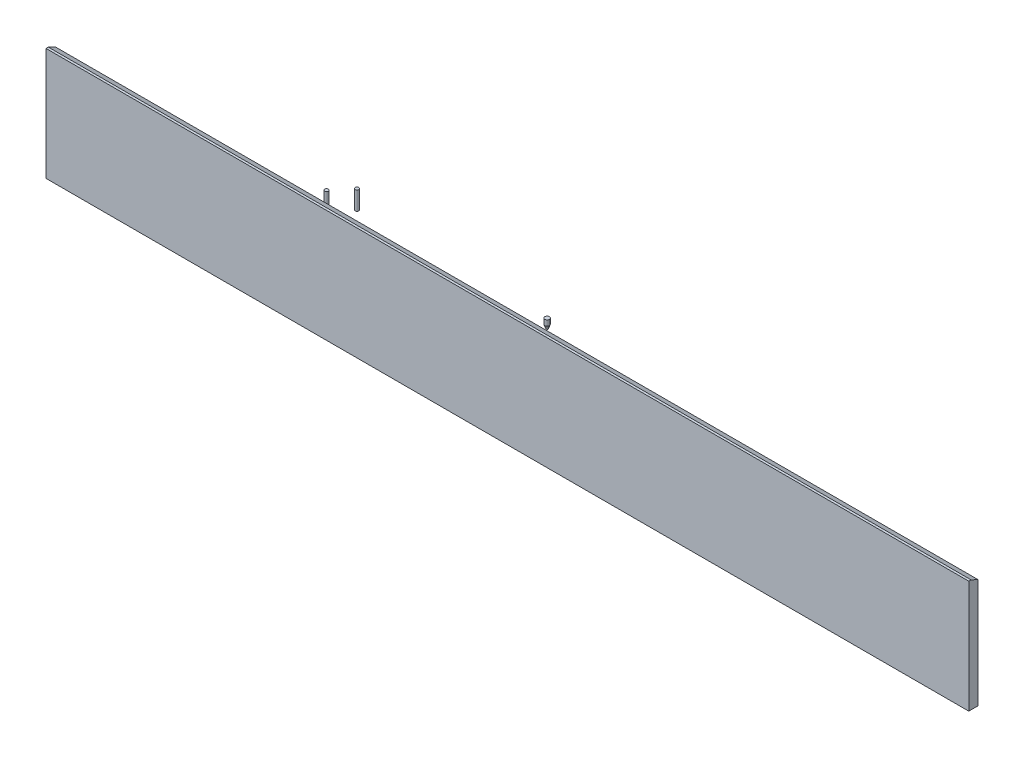
ISO-10303-21;
HEADER;
FILE_DESCRIPTION(('STEP AP214'),'2;1');
FILE_NAME('part.step','',(''),(''),'','','');
FILE_SCHEMA(('AUTOMOTIVE_DESIGN { 1 0 10303 214 1 1 1 1 }'));
ENDSEC;
DATA;
#1=APPLICATION_CONTEXT('core data for automotive mechanical design processes');
#2=APPLICATION_PROTOCOL_DEFINITION('international standard','automotive_design',2000,#1);
#3=PRODUCT_CONTEXT('',#1,'mechanical');
#4=PRODUCT('Part','Part','',(#3));
#5=PRODUCT_RELATED_PRODUCT_CATEGORY('part','',(#4));
#6=PRODUCT_DEFINITION_FORMATION('','',#4);
#7=PRODUCT_DEFINITION_CONTEXT('part definition',#1,'design');
#8=PRODUCT_DEFINITION('design','',#6,#7);
#9=PRODUCT_DEFINITION_SHAPE('','',#8);
#10=(LENGTH_UNIT() NAMED_UNIT(*) SI_UNIT(.MILLI.,.METRE.));
#11=(NAMED_UNIT(*) PLANE_ANGLE_UNIT() SI_UNIT($,.RADIAN.));
#12=(NAMED_UNIT(*) SI_UNIT($,.STERADIAN.) SOLID_ANGLE_UNIT());
#13=UNCERTAINTY_MEASURE_WITH_UNIT(LENGTH_MEASURE(1.E-05),#10,'distance_accuracy_value','');
#14=(GEOMETRIC_REPRESENTATION_CONTEXT(3) GLOBAL_UNCERTAINTY_ASSIGNED_CONTEXT((#13)) GLOBAL_UNIT_ASSIGNED_CONTEXT((#10,
#11,#12)) REPRESENTATION_CONTEXT('',''));
#15=CARTESIAN_POINT('',(0.,0.,0.));
#16=DIRECTION('',(0.,0.,1.));
#17=DIRECTION('',(1.,0.,0.));
#18=AXIS2_PLACEMENT_3D('',#15,#16,#17);
#19=CARTESIAN_POINT('',(-251.,10.,-78.));
#20=DIRECTION('',(0.,-1.,0.));
#21=DIRECTION('',(0.,0.,-1.));
#22=AXIS2_PLACEMENT_3D('',#19,#20,#21);
#23=CYLINDRICAL_SURFACE('',#22,2.);
#24=CARTESIAN_POINT('',(-251.,10.,-78.));
#25=DIRECTION('',(0.,1.,0.));
#26=DIRECTION('',(0.,0.,1.));
#27=AXIS2_PLACEMENT_3D('',#24,#25,#26);
#28=CIRCLE('',#27,2.);
#29=CARTESIAN_POINT('',(-251.,10.,-76.));
#30=VERTEX_POINT('',#29);
#31=EDGE_CURVE('E11',#30,#30,#28,.T.);
#32=ORIENTED_EDGE('',*,*,#31,.F.);
#33=EDGE_LOOP('',(#32));
#34=FACE_BOUND('',#33,.T.);
#35=CARTESIAN_POINT('',(-251.,-10.,-78.));
#36=DIRECTION('',(0.,1.,0.));
#37=DIRECTION('',(0.,0.,1.));
#38=AXIS2_PLACEMENT_3D('',#35,#36,#37);
#39=CIRCLE('',#38,2.);
#40=CARTESIAN_POINT('',(-251.,-10.,-76.));
#41=VERTEX_POINT('',#40);
#42=EDGE_CURVE('E51',#41,#41,#39,.T.);
#43=ORIENTED_EDGE('',*,*,#42,.T.);
#44=EDGE_LOOP('',(#43));
#45=FACE_BOUND('',#44,.T.);
#46=ADVANCED_FACE('F48',(#34,#45),#23,.T.);
#47=CARTESIAN_POINT('',(-251.,10.,-78.));
#48=DIRECTION('',(0.,1.,0.));
#49=DIRECTION('',(0.,0.,1.));
#50=AXIS2_PLACEMENT_3D('',#47,#48,#49);
#51=PLANE('',#50);
#52=ORIENTED_EDGE('',*,*,#31,.T.);
#53=EDGE_LOOP('',(#52));
#54=FACE_BOUND('',#53,.T.);
#55=ADVANCED_FACE('F63',(#54),#51,.T.);
#56=CARTESIAN_POINT('',(-251.,-10.,-78.));
#57=DIRECTION('',(0.,1.,0.));
#58=DIRECTION('',(0.,0.,1.));
#59=AXIS2_PLACEMENT_3D('',#56,#57,#58);
#60=PLANE('',#59);
#61=ORIENTED_EDGE('',*,*,#42,.F.);
#62=EDGE_LOOP('',(#61));
#63=FACE_BOUND('',#62,.T.);
#64=ADVANCED_FACE('F61',(#63),#60,.F.);
#65=CLOSED_SHELL('',(#46,#55,#64));
#66=MANIFOLD_SOLID_BREP('B2',#65);
#67=CARTESIAN_POINT('',(-266.,10.,-60.));
#68=DIRECTION('',(0.,-1.,0.));
#69=DIRECTION('',(0.,0.,-1.));
#70=AXIS2_PLACEMENT_3D('',#67,#68,#69);
#71=CYLINDRICAL_SURFACE('',#70,2.);
#72=CARTESIAN_POINT('',(-266.,10.,-60.));
#73=DIRECTION('',(0.,1.,0.));
#74=DIRECTION('',(0.,0.,1.));
#75=AXIS2_PLACEMENT_3D('',#72,#73,#74);
#76=CIRCLE('',#75,2.);
#77=CARTESIAN_POINT('',(-266.,10.,-58.));
#78=VERTEX_POINT('',#77);
#79=EDGE_CURVE('E47',#78,#78,#76,.T.);
#80=ORIENTED_EDGE('',*,*,#79,.F.);
#81=EDGE_LOOP('',(#80));
#82=FACE_BOUND('',#81,.T.);
#83=CARTESIAN_POINT('',(-266.,-10.,-60.));
#84=DIRECTION('',(0.,1.,0.));
#85=DIRECTION('',(0.,0.,1.));
#86=AXIS2_PLACEMENT_3D('',#83,#84,#85);
#87=CIRCLE('',#86,2.);
#88=CARTESIAN_POINT('',(-266.,-10.,-58.));
#89=VERTEX_POINT('',#88);
#90=EDGE_CURVE('E100',#89,#89,#87,.T.);
#91=ORIENTED_EDGE('',*,*,#90,.T.);
#92=EDGE_LOOP('',(#91));
#93=FACE_BOUND('',#92,.T.);
#94=ADVANCED_FACE('F97',(#82,#93),#71,.T.);
#95=CARTESIAN_POINT('',(-266.,10.,-60.));
#96=DIRECTION('',(0.,1.,0.));
#97=DIRECTION('',(0.,0.,1.));
#98=AXIS2_PLACEMENT_3D('',#95,#96,#97);
#99=PLANE('',#98);
#100=ORIENTED_EDGE('',*,*,#79,.T.);
#101=EDGE_LOOP('',(#100));
#102=FACE_BOUND('',#101,.T.);
#103=ADVANCED_FACE('F112',(#102),#99,.T.);
#104=CARTESIAN_POINT('',(-266.,-10.,-60.));
#105=DIRECTION('',(0.,1.,0.));
#106=DIRECTION('',(0.,0.,1.));
#107=AXIS2_PLACEMENT_3D('',#104,#105,#106);
#108=PLANE('',#107);
#109=ORIENTED_EDGE('',*,*,#90,.F.);
#110=EDGE_LOOP('',(#109));
#111=FACE_BOUND('',#110,.T.);
#112=ADVANCED_FACE('F110',(#111),#108,.F.);
#113=CLOSED_SHELL('',(#94,#103,#112));
#114=MANIFOLD_SOLID_BREP('B6',#113);
#115=CARTESIAN_POINT('',(-22.,36.5,-10.));
#116=DIRECTION('',(0.,-1.,0.));
#117=DIRECTION('',(0.,0.,-1.));
#118=AXIS2_PLACEMENT_3D('',#115,#116,#117);
#119=CYLINDRICAL_SURFACE('',#118,2.5);
#120=CARTESIAN_POINT('',(-22.,36.5,-10.));
#121=DIRECTION('',(0.,1.,0.));
#122=DIRECTION('',(0.,0.,1.));
#123=AXIS2_PLACEMENT_3D('',#120,#121,#122);
#124=CIRCLE('',#123,2.5);
#125=CARTESIAN_POINT('',(-22.,36.5,-7.5));
#126=VERTEX_POINT('',#125);
#127=EDGE_CURVE('E96',#126,#126,#124,.T.);
#128=ORIENTED_EDGE('',*,*,#127,.F.);
#129=EDGE_LOOP('',(#128));
#130=FACE_BOUND('',#129,.T.);
#131=CARTESIAN_POINT('',(-22.,26.5,-10.));
#132=DIRECTION('',(0.,1.,0.));
#133=DIRECTION('',(0.,0.,1.));
#134=AXIS2_PLACEMENT_3D('',#131,#132,#133);
#135=CIRCLE('',#134,2.5);
#136=CARTESIAN_POINT('',(-22.,26.5,-7.5));
#137=VERTEX_POINT('',#136);
#138=EDGE_CURVE('E149',#137,#137,#135,.T.);
#139=ORIENTED_EDGE('',*,*,#138,.T.);
#140=EDGE_LOOP('',(#139));
#141=FACE_BOUND('',#140,.T.);
#142=ADVANCED_FACE('F146',(#130,#141),#119,.T.);
#143=CARTESIAN_POINT('',(-22.,36.5,-10.));
#144=DIRECTION('',(0.,1.,0.));
#145=DIRECTION('',(0.,0.,1.));
#146=AXIS2_PLACEMENT_3D('',#143,#144,#145);
#147=PLANE('',#146);
#148=ORIENTED_EDGE('',*,*,#127,.T.);
#149=EDGE_LOOP('',(#148));
#150=FACE_BOUND('',#149,.T.);
#151=ADVANCED_FACE('F161',(#150),#147,.T.);
#152=CARTESIAN_POINT('',(-22.,26.5,-10.));
#153=DIRECTION('',(0.,1.,0.));
#154=DIRECTION('',(0.,0.,1.));
#155=AXIS2_PLACEMENT_3D('',#152,#153,#154);
#156=PLANE('',#155);
#157=ORIENTED_EDGE('',*,*,#138,.F.);
#158=EDGE_LOOP('',(#157));
#159=FACE_BOUND('',#158,.T.);
#160=ADVANCED_FACE('F159',(#159),#156,.F.);
#161=CLOSED_SHELL('',(#142,#151,#160));
#162=MANIFOLD_SOLID_BREP('B42',#161);
#163=CARTESIAN_POINT('',(0.,36.5,-33.));
#164=DIRECTION('',(0.,-1.,0.));
#165=DIRECTION('',(0.,0.,-1.));
#166=AXIS2_PLACEMENT_3D('',#163,#164,#165);
#167=CYLINDRICAL_SURFACE('',#166,2.5);
#168=CARTESIAN_POINT('',(0.,30.6212161291819,-33.));
#169=DIRECTION('',(0.,1.,0.));
#170=DIRECTION('',(0.,0.,1.));
#171=AXIS2_PLACEMENT_3D('',#168,#169,#170);
#172=CIRCLE('',#171,2.5);
#173=CARTESIAN_POINT('',(0.,30.6212161291819,-30.5));
#174=VERTEX_POINT('',#173);
#175=EDGE_CURVE('E203',#174,#174,#172,.T.);
#176=ORIENTED_EDGE('',*,*,#175,.T.);
#177=EDGE_LOOP('',(#176));
#178=FACE_BOUND('',#177,.T.);
#179=CARTESIAN_POINT('',(0.,36.5,-33.));
#180=DIRECTION('',(0.,1.,0.));
#181=DIRECTION('',(0.,0.,1.));
#182=AXIS2_PLACEMENT_3D('',#179,#180,#181);
#183=CIRCLE('',#182,2.5);
#184=CARTESIAN_POINT('',(0.,36.5,-30.5));
#185=VERTEX_POINT('',#184);
#186=EDGE_CURVE('E207',#185,#185,#183,.T.);
#187=ORIENTED_EDGE('',*,*,#186,.F.);
#188=EDGE_LOOP('',(#187));
#189=FACE_BOUND('',#188,.T.);
#190=ADVANCED_FACE('F196',(#178,#189),#167,.T.);
#191=CARTESIAN_POINT('',(0.,36.5,-33.));
#192=DIRECTION('',(0.,1.,0.));
#193=DIRECTION('',(0.,0.,1.));
#194=AXIS2_PLACEMENT_3D('',#191,#192,#193);
#195=PLANE('',#194);
#196=ORIENTED_EDGE('',*,*,#186,.T.);
#197=EDGE_LOOP('',(#196));
#198=FACE_BOUND('',#197,.T.);
#199=ADVANCED_FACE('F214',(#198),#195,.T.);
#200=CARTESIAN_POINT('',(0.,26.5,-33.));
#201=DIRECTION('',(0.,1.,0.));
#202=DIRECTION('',(0.,0.,1.));
#203=AXIS2_PLACEMENT_3D('',#200,#201,#202);
#204=PLANE('',#203);
#205=CARTESIAN_POINT('',(0.,26.5,-33.));
#206=DIRECTION('',(0.,1.,0.));
#207=DIRECTION('',(0.,0.,1.));
#208=AXIS2_PLACEMENT_3D('',#205,#206,#207);
#209=CIRCLE('',#208,0.999999999999994);
#210=CARTESIAN_POINT('',(0.,26.5,-32.));
#211=VERTEX_POINT('',#210);
#212=EDGE_CURVE('E145',#211,#211,#209,.F.);
#213=ORIENTED_EDGE('',*,*,#212,.T.);
#214=EDGE_LOOP('',(#213));
#215=FACE_BOUND('',#214,.T.);
#216=ADVANCED_FACE('F220',(#215),#204,.F.);
#217=CARTESIAN_POINT('',(0.,30.6212161291819,-33.));
#218=DIRECTION('',(0.,1.,0.));
#219=DIRECTION('',(0.,0.,1.));
#220=AXIS2_PLACEMENT_3D('',#217,#218,#219);
#221=CONICAL_SURFACE('',#220,2.5,0.349065850398867);
#222=ORIENTED_EDGE('',*,*,#212,.F.);
#223=EDGE_LOOP('',(#222));
#224=FACE_BOUND('',#223,.T.);
#225=ORIENTED_EDGE('',*,*,#175,.F.);
#226=EDGE_LOOP('',(#225));
#227=FACE_BOUND('',#226,.T.);
#228=ADVANCED_FACE('F198',(#224,#227),#221,.T.);
#229=CLOSED_SHELL('',(#190,#199,#216,#228));
#230=MANIFOLD_SOLID_BREP('B91',#229);
#231=CARTESIAN_POINT('',(-500.,60.9999999999999,10.));
#232=DIRECTION('',(1.,0.,0.));
#233=DIRECTION('',(0.,1.,0.));
#234=AXIS2_PLACEMENT_3D('',#231,#232,#233);
#235=PLANE('',#234);
#236=DIRECTION('',(0.,0.,-1.));
#237=VECTOR('',#236,1.);
#238=CARTESIAN_POINT('',(-500.,60.9999999999999,10.));
#239=LINE('',#238,#237);
#240=CARTESIAN_POINT('',(-500.,60.9999999999999,10.));
#241=VERTEX_POINT('',#240);
#242=CARTESIAN_POINT('',(-500.,60.9999999999999,7.50577422178345));
#243=VERTEX_POINT('',#242);
#244=EDGE_CURVE('E538',#241,#243,#239,.T.);
#245=ORIENTED_EDGE('',*,*,#244,.T.);
#246=DIRECTION('',(0.,-0.422618261740706,-0.906307787036647));
#247=VECTOR('',#246,1.);
#248=CARTESIAN_POINT('',(-500.,60.9999999999999,7.50577422178332));
#249=LINE('',#248,#247);
#250=CARTESIAN_POINT('',(-500.,57.4999999999999,0.));
#251=VERTEX_POINT('',#250);
#252=EDGE_CURVE('E560',#243,#251,#249,.T.);
#253=ORIENTED_EDGE('',*,*,#252,.T.);
#254=DIRECTION('',(0.,-1.,0.));
#255=VECTOR('',#254,1.);
#256=CARTESIAN_POINT('',(-500.,60.9999999999999,0.));
#257=LINE('',#256,#255);
#258=CARTESIAN_POINT('',(-500.,-61.0000000000001,0.));
#259=VERTEX_POINT('',#258);
#260=EDGE_CURVE('E415',#251,#259,#257,.T.);
#261=ORIENTED_EDGE('',*,*,#260,.T.);
#262=DIRECTION('',(0.,0.,-1.));
#263=VECTOR('',#262,1.);
#264=CARTESIAN_POINT('',(-500.,-61.0000000000001,10.));
#265=LINE('',#264,#263);
#266=CARTESIAN_POINT('',(-500.,-61.0000000000001,10.));
#267=VERTEX_POINT('',#266);
#268=EDGE_CURVE('E553',#267,#259,#265,.T.);
#269=ORIENTED_EDGE('',*,*,#268,.F.);
#270=DIRECTION('',(0.,-1.,0.));
#271=VECTOR('',#270,1.);
#272=CARTESIAN_POINT('',(-500.,60.9999999999999,10.));
#273=LINE('',#272,#271);
#274=EDGE_CURVE('E525',#241,#267,#273,.T.);
#275=ORIENTED_EDGE('',*,*,#274,.F.);
#276=EDGE_LOOP('',(#245,#253,#261,#269,#275));
#277=FACE_BOUND('',#276,.T.);
#278=ADVANCED_FACE('F252',(#277),#235,.F.);
#279=CARTESIAN_POINT('',(500.,-60.9999999999999,10.));
#280=DIRECTION('',(0.,1.,0.));
#281=DIRECTION('',(-1.,0.,0.));
#282=AXIS2_PLACEMENT_3D('',#279,#280,#281);
#283=PLANE('',#282);
#284=DIRECTION('',(1.,0.,0.));
#285=VECTOR('',#284,1.);
#286=CARTESIAN_POINT('',(500.,-60.9999999999999,0.));
#287=LINE('',#286,#285);
#288=CARTESIAN_POINT('',(500.,-60.9999999999999,0.));
#289=VERTEX_POINT('',#288);
#290=EDGE_CURVE('E541',#259,#289,#287,.T.);
#291=ORIENTED_EDGE('',*,*,#290,.T.);
#292=DIRECTION('',(0.,0.,-1.));
#293=VECTOR('',#292,1.);
#294=CARTESIAN_POINT('',(500.,-60.9999999999999,10.));
#295=LINE('',#294,#293);
#296=CARTESIAN_POINT('',(500.,-60.9999999999999,10.));
#297=VERTEX_POINT('',#296);
#298=EDGE_CURVE('E550',#297,#289,#295,.T.);
#299=ORIENTED_EDGE('',*,*,#298,.F.);
#300=DIRECTION('',(1.,0.,0.));
#301=VECTOR('',#300,1.);
#302=CARTESIAN_POINT('',(500.,-60.9999999999999,10.));
#303=LINE('',#302,#301);
#304=EDGE_CURVE('E529',#267,#297,#303,.T.);
#305=ORIENTED_EDGE('',*,*,#304,.F.);
#306=ORIENTED_EDGE('',*,*,#268,.T.);
#307=EDGE_LOOP('',(#291,#299,#305,#306));
#308=FACE_BOUND('',#307,.T.);
#309=ADVANCED_FACE('F581',(#308),#283,.F.);
#310=CARTESIAN_POINT('',(500.,61.0000000000001,10.));
#311=DIRECTION('',(-1.,0.,0.));
#312=DIRECTION('',(0.,0.,1.));
#313=AXIS2_PLACEMENT_3D('',#310,#311,#312);
#314=PLANE('',#313);
#315=DIRECTION('',(0.,1.,0.));
#316=VECTOR('',#315,1.);
#317=CARTESIAN_POINT('',(500.,61.0000000000001,0.));
#318=LINE('',#317,#316);
#319=CARTESIAN_POINT('',(500.,57.5,0.));
#320=VERTEX_POINT('',#319);
#321=EDGE_CURVE('E530',#289,#320,#318,.T.);
#322=ORIENTED_EDGE('',*,*,#321,.T.);
#323=DIRECTION('',(0.,0.422618261740706,0.906307787036647));
#324=VECTOR('',#323,1.);
#325=CARTESIAN_POINT('',(500.,61.0000000000001,7.50577422178345));
#326=LINE('',#325,#324);
#327=CARTESIAN_POINT('',(500.,61.0000000000001,7.50577422178345));
#328=VERTEX_POINT('',#327);
#329=EDGE_CURVE('E194',#320,#328,#326,.T.);
#330=ORIENTED_EDGE('',*,*,#329,.T.);
#331=DIRECTION('',(0.,0.,-1.));
#332=VECTOR('',#331,1.);
#333=CARTESIAN_POINT('',(500.,61.0000000000001,10.));
#334=LINE('',#333,#332);
#335=CARTESIAN_POINT('',(500.,61.0000000000001,10.));
#336=VERTEX_POINT('',#335);
#337=EDGE_CURVE('E547',#336,#328,#334,.T.);
#338=ORIENTED_EDGE('',*,*,#337,.F.);
#339=DIRECTION('',(0.,1.,0.));
#340=VECTOR('',#339,1.);
#341=CARTESIAN_POINT('',(500.,61.0000000000001,10.));
#342=LINE('',#341,#340);
#343=EDGE_CURVE('E533',#297,#336,#342,.T.);
#344=ORIENTED_EDGE('',*,*,#343,.F.);
#345=ORIENTED_EDGE('',*,*,#298,.T.);
#346=EDGE_LOOP('',(#322,#330,#338,#344,#345));
#347=FACE_BOUND('',#346,.T.);
#348=ADVANCED_FACE('F572',(#347),#314,.F.);
#349=CARTESIAN_POINT('',(500.,61.0000000000001,10.));
#350=DIRECTION('',(0.,-1.,0.));
#351=DIRECTION('',(1.,0.,0.));
#352=AXIS2_PLACEMENT_3D('',#349,#350,#351);
#353=PLANE('',#352);
#354=ORIENTED_EDGE('',*,*,#337,.T.);
#355=DIRECTION('',(-1.,0.,0.));
#356=VECTOR('',#355,1.);
#357=CARTESIAN_POINT('',(-500.,60.9999999999999,7.50577422178345));
#358=LINE('',#357,#356);
#359=EDGE_CURVE('E556',#328,#243,#358,.T.);
#360=ORIENTED_EDGE('',*,*,#359,.T.);
#361=ORIENTED_EDGE('',*,*,#244,.F.);
#362=DIRECTION('',(-1.,0.,0.));
#363=VECTOR('',#362,1.);
#364=CARTESIAN_POINT('',(500.,61.0000000000001,10.));
#365=LINE('',#364,#363);
#366=EDGE_CURVE('E535',#336,#241,#365,.T.);
#367=ORIENTED_EDGE('',*,*,#366,.F.);
#368=EDGE_LOOP('',(#354,#360,#361,#367));
#369=FACE_BOUND('',#368,.T.);
#370=ADVANCED_FACE('F576',(#369),#353,.F.);
#371=CARTESIAN_POINT('',(0.,0.,10.));
#372=DIRECTION('',(0.,0.,-1.));
#373=DIRECTION('',(-1.,0.,0.));
#374=AXIS2_PLACEMENT_3D('',#371,#372,#373);
#375=PLANE('',#374);
#376=ORIENTED_EDGE('',*,*,#274,.T.);
#377=ORIENTED_EDGE('',*,*,#304,.T.);
#378=ORIENTED_EDGE('',*,*,#343,.T.);
#379=ORIENTED_EDGE('',*,*,#366,.T.);
#380=EDGE_LOOP('',(#376,#377,#378,#379));
#381=FACE_BOUND('',#380,.T.);
#382=ADVANCED_FACE('F578',(#381),#375,.F.);
#383=CARTESIAN_POINT('',(0.,0.,0.));
#384=DIRECTION('',(0.,0.,-1.));
#385=DIRECTION('',(-1.,0.,0.));
#386=AXIS2_PLACEMENT_3D('',#383,#384,#385);
#387=PLANE('',#386);
#388=DIRECTION('',(1.,0.,0.));
#389=VECTOR('',#388,1.);
#390=CARTESIAN_POINT('',(-276.,10.,0.));
#391=LINE('',#390,#389);
#392=CARTESIAN_POINT('',(-276.,10.,0.));
#393=VERTEX_POINT('',#392);
#394=CARTESIAN_POINT('',(-156.,10.,0.));
#395=VERTEX_POINT('',#394);
#396=EDGE_CURVE('E396',#393,#395,#391,.T.);
#397=ORIENTED_EDGE('',*,*,#396,.F.);
#398=DIRECTION('',(0.,-1.,0.));
#399=VECTOR('',#398,1.);
#400=CARTESIAN_POINT('',(-276.,10.,0.));
#401=LINE('',#400,#399);
#402=CARTESIAN_POINT('',(-276.,-10.,0.));
#403=VERTEX_POINT('',#402);
#404=EDGE_CURVE('E408',#393,#403,#401,.T.);
#405=ORIENTED_EDGE('',*,*,#404,.T.);
#406=DIRECTION('',(1.,0.,0.));
#407=VECTOR('',#406,1.);
#408=CARTESIAN_POINT('',(-276.,-10.,0.));
#409=LINE('',#408,#407);
#410=CARTESIAN_POINT('',(-156.,-10.,0.));
#411=VERTEX_POINT('',#410);
#412=EDGE_CURVE('E455',#403,#411,#409,.T.);
#413=ORIENTED_EDGE('',*,*,#412,.T.);
#414=DIRECTION('',(0.,-1.,0.));
#415=VECTOR('',#414,1.);
#416=CARTESIAN_POINT('',(-156.,10.,0.));
#417=LINE('',#416,#415);
#418=EDGE_CURVE('E416',#395,#411,#417,.T.);
#419=ORIENTED_EDGE('',*,*,#418,.F.);
#420=EDGE_LOOP('',(#397,#405,#413,#419));
#421=FACE_BOUND('',#420,.T.);
#422=ORIENTED_EDGE('',*,*,#260,.F.);
#423=DIRECTION('',(1.,0.,0.));
#424=VECTOR('',#423,1.);
#425=CARTESIAN_POINT('',(500.,57.5,0.));
#426=LINE('',#425,#424);
#427=EDGE_CURVE('E260',#251,#320,#426,.T.);
#428=ORIENTED_EDGE('',*,*,#427,.T.);
#429=ORIENTED_EDGE('',*,*,#321,.F.);
#430=ORIENTED_EDGE('',*,*,#290,.F.);
#431=EDGE_LOOP('',(#422,#428,#429,#430));
#432=FACE_BOUND('',#431,.T.);
#433=ADVANCED_FACE('F419',(#421,#432),#387,.T.);
#434=CARTESIAN_POINT('',(500.,61.0000000000001,7.50577422178345));
#435=DIRECTION('',(0.,0.906307787036647,-0.422618261740706));
#436=DIRECTION('',(1.,0.,0.));
#437=AXIS2_PLACEMENT_3D('',#434,#435,#436);
#438=PLANE('',#437);
#439=ORIENTED_EDGE('',*,*,#329,.F.);
#440=ORIENTED_EDGE('',*,*,#427,.F.);
#441=ORIENTED_EDGE('',*,*,#252,.F.);
#442=ORIENTED_EDGE('',*,*,#359,.F.);
#443=EDGE_LOOP('',(#439,#440,#441,#442));
#444=FACE_BOUND('',#443,.T.);
#445=ADVANCED_FACE('F254',(#444),#438,.T.);
#446=CARTESIAN_POINT('',(-276.,10.,-14.));
#447=DIRECTION('',(1.,0.,0.));
#448=DIRECTION('',(0.,0.,-1.));
#449=AXIS2_PLACEMENT_3D('',#446,#447,#448);
#450=PLANE('',#449);
#451=DIRECTION('',(0.,0.,1.));
#452=VECTOR('',#451,1.);
#453=CARTESIAN_POINT('',(-276.,-10.,-14.));
#454=LINE('',#453,#452);
#455=CARTESIAN_POINT('',(-276.,-10.,-14.));
#456=VERTEX_POINT('',#455);
#457=EDGE_CURVE('E411',#456,#403,#454,.T.);
#458=ORIENTED_EDGE('',*,*,#457,.T.);
#459=ORIENTED_EDGE('',*,*,#404,.F.);
#460=DIRECTION('',(0.,0.,1.));
#461=VECTOR('',#460,1.);
#462=CARTESIAN_POINT('',(-276.,10.,-14.));
#463=LINE('',#462,#461);
#464=CARTESIAN_POINT('',(-276.,10.,-14.));
#465=VERTEX_POINT('',#464);
#466=EDGE_CURVE('E392',#465,#393,#463,.T.);
#467=ORIENTED_EDGE('',*,*,#466,.F.);
#468=DIRECTION('',(0.,-1.,0.));
#469=VECTOR('',#468,1.);
#470=CARTESIAN_POINT('',(-276.,10.,-14.));
#471=LINE('',#470,#469);
#472=EDGE_CURVE('E453',#465,#456,#471,.T.);
#473=ORIENTED_EDGE('',*,*,#472,.T.);
#474=EDGE_LOOP('',(#458,#459,#467,#473));
#475=FACE_BOUND('',#474,.T.);
#476=ADVANCED_FACE('F409',(#475),#450,.F.);
#477=CARTESIAN_POINT('',(-156.,10.,-14.));
#478=DIRECTION('',(-1.,0.,0.));
#479=DIRECTION('',(0.,0.,1.));
#480=AXIS2_PLACEMENT_3D('',#477,#478,#479);
#481=PLANE('',#480);
#482=DIRECTION('',(0.,0.,-1.));
#483=VECTOR('',#482,1.);
#484=CARTESIAN_POINT('',(-156.,-10.,-14.));
#485=LINE('',#484,#483);
#486=CARTESIAN_POINT('',(-156.,-10.,-14.));
#487=VERTEX_POINT('',#486);
#488=EDGE_CURVE('E270',#411,#487,#485,.T.);
#489=ORIENTED_EDGE('',*,*,#488,.T.);
#490=DIRECTION('',(0.,-1.,0.));
#491=VECTOR('',#490,1.);
#492=CARTESIAN_POINT('',(-156.,10.,-14.));
#493=LINE('',#492,#491);
#494=CARTESIAN_POINT('',(-156.,10.,-14.));
#495=VERTEX_POINT('',#494);
#496=EDGE_CURVE('E519',#495,#487,#493,.T.);
#497=ORIENTED_EDGE('',*,*,#496,.F.);
#498=DIRECTION('',(0.,0.,-1.));
#499=VECTOR('',#498,1.);
#500=CARTESIAN_POINT('',(-156.,10.,-14.));
#501=LINE('',#500,#499);
#502=EDGE_CURVE('E421',#395,#495,#501,.T.);
#503=ORIENTED_EDGE('',*,*,#502,.F.);
#504=ORIENTED_EDGE('',*,*,#418,.T.);
#505=EDGE_LOOP('',(#489,#497,#503,#504));
#506=FACE_BOUND('',#505,.T.);
#507=ADVANCED_FACE('F598',(#506),#481,.F.);
#508=CARTESIAN_POINT('',(-187.,10.,-14.));
#509=DIRECTION('',(0.,0.,1.));
#510=DIRECTION('',(1.,0.,0.));
#511=AXIS2_PLACEMENT_3D('',#508,#509,#510);
#512=PLANE('',#511);
#513=DIRECTION('',(-1.,0.,0.));
#514=VECTOR('',#513,1.);
#515=CARTESIAN_POINT('',(-187.,-10.,-14.));
#516=LINE('',#515,#514);
#517=CARTESIAN_POINT('',(-187.,-10.,-14.));
#518=VERTEX_POINT('',#517);
#519=EDGE_CURVE('E459',#487,#518,#516,.T.);
#520=ORIENTED_EDGE('',*,*,#519,.T.);
#521=DIRECTION('',(0.,-1.,0.));
#522=VECTOR('',#521,1.);
#523=CARTESIAN_POINT('',(-187.,10.,-14.));
#524=LINE('',#523,#522);
#525=CARTESIAN_POINT('',(-187.,10.,-14.));
#526=VERTEX_POINT('',#525);
#527=EDGE_CURVE('E515',#526,#518,#524,.T.);
#528=ORIENTED_EDGE('',*,*,#527,.F.);
#529=DIRECTION('',(-1.,0.,0.));
#530=VECTOR('',#529,1.);
#531=CARTESIAN_POINT('',(-187.,10.,-14.));
#532=LINE('',#531,#530);
#533=EDGE_CURVE('E426',#495,#526,#532,.T.);
#534=ORIENTED_EDGE('',*,*,#533,.F.);
#535=ORIENTED_EDGE('',*,*,#496,.T.);
#536=EDGE_LOOP('',(#520,#528,#534,#535));
#537=FACE_BOUND('',#536,.T.);
#538=ADVANCED_FACE('F601',(#537),#512,.F.);
#539=CARTESIAN_POINT('',(-187.,10.,-16.));
#540=DIRECTION('',(-1.,0.,0.));
#541=DIRECTION('',(0.,0.,1.));
#542=AXIS2_PLACEMENT_3D('',#539,#540,#541);
#543=PLANE('',#542);
#544=DIRECTION('',(0.,0.,-1.));
#545=VECTOR('',#544,1.);
#546=CARTESIAN_POINT('',(-187.,-10.,-16.));
#547=LINE('',#546,#545);
#548=CARTESIAN_POINT('',(-187.,-10.,-16.));
#549=VERTEX_POINT('',#548);
#550=EDGE_CURVE('E462',#518,#549,#547,.T.);
#551=ORIENTED_EDGE('',*,*,#550,.T.);
#552=DIRECTION('',(0.,-1.,0.));
#553=VECTOR('',#552,1.);
#554=CARTESIAN_POINT('',(-187.,10.,-16.));
#555=LINE('',#554,#553);
#556=CARTESIAN_POINT('',(-187.,10.,-16.));
#557=VERTEX_POINT('',#556);
#558=EDGE_CURVE('E511',#557,#549,#555,.T.);
#559=ORIENTED_EDGE('',*,*,#558,.F.);
#560=DIRECTION('',(0.,0.,-1.));
#561=VECTOR('',#560,1.);
#562=CARTESIAN_POINT('',(-187.,10.,-16.));
#563=LINE('',#562,#561);
#564=EDGE_CURVE('E431',#526,#557,#563,.T.);
#565=ORIENTED_EDGE('',*,*,#564,.F.);
#566=ORIENTED_EDGE('',*,*,#527,.T.);
#567=EDGE_LOOP('',(#551,#559,#565,#566));
#568=FACE_BOUND('',#567,.T.);
#569=ADVANCED_FACE('F605',(#568),#543,.F.);
#570=CARTESIAN_POINT('',(-189.,10.,-16.));
#571=DIRECTION('',(0.,-1.,0.));
#572=DIRECTION('',(0.,0.,-1.));
#573=AXIS2_PLACEMENT_3D('',#570,#571,#572);
#574=CYLINDRICAL_SURFACE('',#573,2.);
#575=CARTESIAN_POINT('',(-189.,-10.,-16.));
#576=DIRECTION('',(0.,1.,0.));
#577=DIRECTION('',(0.,0.,1.));
#578=AXIS2_PLACEMENT_3D('',#575,#576,#577);
#579=CIRCLE('',#578,2.);
#580=CARTESIAN_POINT('',(-191.,-10.,-16.));
#581=VERTEX_POINT('',#580);
#582=EDGE_CURVE('E465',#549,#581,#579,.T.);
#583=ORIENTED_EDGE('',*,*,#582,.T.);
#584=DIRECTION('',(0.,-1.,0.));
#585=VECTOR('',#584,1.);
#586=CARTESIAN_POINT('',(-191.,10.,-16.));
#587=LINE('',#586,#585);
#588=CARTESIAN_POINT('',(-191.,10.,-16.));
#589=VERTEX_POINT('',#588);
#590=EDGE_CURVE('E507',#589,#581,#587,.T.);
#591=ORIENTED_EDGE('',*,*,#590,.F.);
#592=CARTESIAN_POINT('',(-189.,10.,-16.));
#593=DIRECTION('',(0.,1.,0.));
#594=DIRECTION('',(0.,0.,1.));
#595=AXIS2_PLACEMENT_3D('',#592,#593,#594);
#596=CIRCLE('',#595,2.);
#597=EDGE_CURVE('E434',#557,#589,#596,.T.);
#598=ORIENTED_EDGE('',*,*,#597,.F.);
#599=ORIENTED_EDGE('',*,*,#558,.T.);
#600=EDGE_LOOP('',(#583,#591,#598,#599));
#601=FACE_BOUND('',#600,.T.);
#602=ADVANCED_FACE('F609',(#601),#574,.T.);
#603=CARTESIAN_POINT('',(-191.,10.,-16.));
#604=DIRECTION('',(1.,0.,0.));
#605=DIRECTION('',(0.,0.,-1.));
#606=AXIS2_PLACEMENT_3D('',#603,#604,#605);
#607=PLANE('',#606);
#608=DIRECTION('',(0.,0.,1.));
#609=VECTOR('',#608,1.);
#610=CARTESIAN_POINT('',(-191.,-10.,-16.));
#611=LINE('',#610,#609);
#612=CARTESIAN_POINT('',(-191.,-10.,-14.));
#613=VERTEX_POINT('',#612);
#614=EDGE_CURVE('E468',#581,#613,#611,.T.);
#615=ORIENTED_EDGE('',*,*,#614,.T.);
#616=DIRECTION('',(0.,-1.,0.));
#617=VECTOR('',#616,1.);
#618=CARTESIAN_POINT('',(-191.,10.,-14.));
#619=LINE('',#618,#617);
#620=CARTESIAN_POINT('',(-191.,10.,-14.));
#621=VERTEX_POINT('',#620);
#622=EDGE_CURVE('E503',#621,#613,#619,.T.);
#623=ORIENTED_EDGE('',*,*,#622,.F.);
#624=DIRECTION('',(0.,0.,1.));
#625=VECTOR('',#624,1.);
#626=CARTESIAN_POINT('',(-191.,10.,-16.));
#627=LINE('',#626,#625);
#628=EDGE_CURVE('E437',#589,#621,#627,.T.);
#629=ORIENTED_EDGE('',*,*,#628,.F.);
#630=ORIENTED_EDGE('',*,*,#590,.T.);
#631=EDGE_LOOP('',(#615,#623,#629,#630));
#632=FACE_BOUND('',#631,.T.);
#633=ADVANCED_FACE('F613',(#632),#607,.F.);
#634=CARTESIAN_POINT('',(-217.,10.,-14.));
#635=DIRECTION('',(0.,0.,1.));
#636=DIRECTION('',(1.,0.,0.));
#637=AXIS2_PLACEMENT_3D('',#634,#635,#636);
#638=PLANE('',#637);
#639=DIRECTION('',(-1.,0.,0.));
#640=VECTOR('',#639,1.);
#641=CARTESIAN_POINT('',(-217.,-10.,-14.));
#642=LINE('',#641,#640);
#643=CARTESIAN_POINT('',(-217.,-10.,-14.));
#644=VERTEX_POINT('',#643);
#645=EDGE_CURVE('E471',#613,#644,#642,.T.);
#646=ORIENTED_EDGE('',*,*,#645,.T.);
#647=DIRECTION('',(0.,-1.,0.));
#648=VECTOR('',#647,1.);
#649=CARTESIAN_POINT('',(-217.,10.,-14.));
#650=LINE('',#649,#648);
#651=CARTESIAN_POINT('',(-217.,10.,-14.));
#652=VERTEX_POINT('',#651);
#653=EDGE_CURVE('E499',#652,#644,#650,.T.);
#654=ORIENTED_EDGE('',*,*,#653,.F.);
#655=DIRECTION('',(-1.,0.,0.));
#656=VECTOR('',#655,1.);
#657=CARTESIAN_POINT('',(-217.,10.,-14.));
#658=LINE('',#657,#656);
#659=EDGE_CURVE('E440',#621,#652,#658,.T.);
#660=ORIENTED_EDGE('',*,*,#659,.F.);
#661=ORIENTED_EDGE('',*,*,#622,.T.);
#662=EDGE_LOOP('',(#646,#654,#660,#661));
#663=FACE_BOUND('',#662,.T.);
#664=ADVANCED_FACE('F617',(#663),#638,.F.);
#665=CARTESIAN_POINT('',(-217.,10.,-16.));
#666=DIRECTION('',(-1.,0.,0.));
#667=DIRECTION('',(0.,0.,1.));
#668=AXIS2_PLACEMENT_3D('',#665,#666,#667);
#669=PLANE('',#668);
#670=DIRECTION('',(0.,0.,-1.));
#671=VECTOR('',#670,1.);
#672=CARTESIAN_POINT('',(-217.,-10.,-16.));
#673=LINE('',#672,#671);
#674=CARTESIAN_POINT('',(-217.,-10.,-16.));
#675=VERTEX_POINT('',#674);
#676=EDGE_CURVE('E474',#644,#675,#673,.T.);
#677=ORIENTED_EDGE('',*,*,#676,.T.);
#678=DIRECTION('',(0.,-1.,0.));
#679=VECTOR('',#678,1.);
#680=CARTESIAN_POINT('',(-217.,10.,-16.));
#681=LINE('',#680,#679);
#682=CARTESIAN_POINT('',(-217.,10.,-16.));
#683=VERTEX_POINT('',#682);
#684=EDGE_CURVE('E495',#683,#675,#681,.T.);
#685=ORIENTED_EDGE('',*,*,#684,.F.);
#686=DIRECTION('',(0.,0.,-1.));
#687=VECTOR('',#686,1.);
#688=CARTESIAN_POINT('',(-217.,10.,-16.));
#689=LINE('',#688,#687);
#690=EDGE_CURVE('E443',#652,#683,#689,.T.);
#691=ORIENTED_EDGE('',*,*,#690,.F.);
#692=ORIENTED_EDGE('',*,*,#653,.T.);
#693=EDGE_LOOP('',(#677,#685,#691,#692));
#694=FACE_BOUND('',#693,.T.);
#695=ADVANCED_FACE('F621',(#694),#669,.F.);
#696=CARTESIAN_POINT('',(-219.,10.,-16.));
#697=DIRECTION('',(0.,-1.,0.));
#698=DIRECTION('',(0.,0.,-1.));
#699=AXIS2_PLACEMENT_3D('',#696,#697,#698);
#700=CYLINDRICAL_SURFACE('',#699,2.);
#701=CARTESIAN_POINT('',(-219.,-10.,-16.));
#702=DIRECTION('',(0.,1.,0.));
#703=DIRECTION('',(0.,0.,1.));
#704=AXIS2_PLACEMENT_3D('',#701,#702,#703);
#705=CIRCLE('',#704,2.);
#706=CARTESIAN_POINT('',(-221.,-10.,-16.));
#707=VERTEX_POINT('',#706);
#708=EDGE_CURVE('E477',#675,#707,#705,.T.);
#709=ORIENTED_EDGE('',*,*,#708,.T.);
#710=DIRECTION('',(0.,-1.,0.));
#711=VECTOR('',#710,1.);
#712=CARTESIAN_POINT('',(-221.,10.,-16.));
#713=LINE('',#712,#711);
#714=CARTESIAN_POINT('',(-221.,10.,-16.));
#715=VERTEX_POINT('',#714);
#716=EDGE_CURVE('E491',#715,#707,#713,.T.);
#717=ORIENTED_EDGE('',*,*,#716,.F.);
#718=CARTESIAN_POINT('',(-219.,10.,-16.));
#719=DIRECTION('',(0.,1.,0.));
#720=DIRECTION('',(0.,0.,1.));
#721=AXIS2_PLACEMENT_3D('',#718,#719,#720);
#722=CIRCLE('',#721,2.);
#723=EDGE_CURVE('E446',#683,#715,#722,.T.);
#724=ORIENTED_EDGE('',*,*,#723,.F.);
#725=ORIENTED_EDGE('',*,*,#684,.T.);
#726=EDGE_LOOP('',(#709,#717,#724,#725));
#727=FACE_BOUND('',#726,.T.);
#728=ADVANCED_FACE('F625',(#727),#700,.T.);
#729=CARTESIAN_POINT('',(-221.,10.,-16.));
#730=DIRECTION('',(1.,0.,0.));
#731=DIRECTION('',(0.,0.,-1.));
#732=AXIS2_PLACEMENT_3D('',#729,#730,#731);
#733=PLANE('',#732);
#734=DIRECTION('',(0.,0.,1.));
#735=VECTOR('',#734,1.);
#736=CARTESIAN_POINT('',(-221.,-10.,-16.));
#737=LINE('',#736,#735);
#738=CARTESIAN_POINT('',(-221.,-10.,-14.));
#739=VERTEX_POINT('',#738);
#740=EDGE_CURVE('E480',#707,#739,#737,.T.);
#741=ORIENTED_EDGE('',*,*,#740,.T.);
#742=DIRECTION('',(0.,-1.,0.));
#743=VECTOR('',#742,1.);
#744=CARTESIAN_POINT('',(-221.,10.,-14.));
#745=LINE('',#744,#743);
#746=CARTESIAN_POINT('',(-221.,10.,-14.));
#747=VERTEX_POINT('',#746);
#748=EDGE_CURVE('E487',#747,#739,#745,.T.);
#749=ORIENTED_EDGE('',*,*,#748,.F.);
#750=DIRECTION('',(0.,0.,1.));
#751=VECTOR('',#750,1.);
#752=CARTESIAN_POINT('',(-221.,10.,-16.));
#753=LINE('',#752,#751);
#754=EDGE_CURVE('E449',#715,#747,#753,.T.);
#755=ORIENTED_EDGE('',*,*,#754,.F.);
#756=ORIENTED_EDGE('',*,*,#716,.T.);
#757=EDGE_LOOP('',(#741,#749,#755,#756));
#758=FACE_BOUND('',#757,.T.);
#759=ADVANCED_FACE('F629',(#758),#733,.F.);
#760=CARTESIAN_POINT('',(-276.,10.,-14.));
#761=DIRECTION('',(0.,0.,1.));
#762=DIRECTION('',(1.,0.,0.));
#763=AXIS2_PLACEMENT_3D('',#760,#761,#762);
#764=PLANE('',#763);
#765=DIRECTION('',(-1.,0.,0.));
#766=VECTOR('',#765,1.);
#767=CARTESIAN_POINT('',(-276.,-10.,-14.));
#768=LINE('',#767,#766);
#769=EDGE_CURVE('E404',#739,#456,#768,.T.);
#770=ORIENTED_EDGE('',*,*,#769,.T.);
#771=ORIENTED_EDGE('',*,*,#472,.F.);
#772=DIRECTION('',(-1.,0.,0.));
#773=VECTOR('',#772,1.);
#774=CARTESIAN_POINT('',(-276.,10.,-14.));
#775=LINE('',#774,#773);
#776=EDGE_CURVE('E399',#747,#465,#775,.T.);
#777=ORIENTED_EDGE('',*,*,#776,.F.);
#778=ORIENTED_EDGE('',*,*,#748,.T.);
#779=EDGE_LOOP('',(#770,#771,#777,#778));
#780=FACE_BOUND('',#779,.T.);
#781=ADVANCED_FACE('F633',(#780),#764,.F.);
#782=CARTESIAN_POINT('',(-189.,10.,-16.));
#783=DIRECTION('',(0.,1.,0.));
#784=DIRECTION('',(0.,0.,1.));
#785=AXIS2_PLACEMENT_3D('',#782,#783,#784);
#786=PLANE('',#785);
#787=ORIENTED_EDGE('',*,*,#466,.T.);
#788=ORIENTED_EDGE('',*,*,#396,.T.);
#789=ORIENTED_EDGE('',*,*,#502,.T.);
#790=ORIENTED_EDGE('',*,*,#533,.T.);
#791=ORIENTED_EDGE('',*,*,#564,.T.);
#792=ORIENTED_EDGE('',*,*,#597,.T.);
#793=ORIENTED_EDGE('',*,*,#628,.T.);
#794=ORIENTED_EDGE('',*,*,#659,.T.);
#795=ORIENTED_EDGE('',*,*,#690,.T.);
#796=ORIENTED_EDGE('',*,*,#723,.T.);
#797=ORIENTED_EDGE('',*,*,#754,.T.);
#798=ORIENTED_EDGE('',*,*,#776,.T.);
#799=EDGE_LOOP('',(#787,#788,#789,#790,#791,#792,#793,#794,#795,#796,#797,#798));
#800=FACE_BOUND('',#799,.T.);
#801=ADVANCED_FACE('F394',(#800),#786,.T.);
#802=CARTESIAN_POINT('',(-189.,-10.,-16.));
#803=DIRECTION('',(0.,1.,0.));
#804=DIRECTION('',(0.,0.,1.));
#805=AXIS2_PLACEMENT_3D('',#802,#803,#804);
#806=PLANE('',#805);
#807=ORIENTED_EDGE('',*,*,#457,.F.);
#808=ORIENTED_EDGE('',*,*,#769,.F.);
#809=ORIENTED_EDGE('',*,*,#740,.F.);
#810=ORIENTED_EDGE('',*,*,#708,.F.);
#811=ORIENTED_EDGE('',*,*,#676,.F.);
#812=ORIENTED_EDGE('',*,*,#645,.F.);
#813=ORIENTED_EDGE('',*,*,#614,.F.);
#814=ORIENTED_EDGE('',*,*,#582,.F.);
#815=ORIENTED_EDGE('',*,*,#550,.F.);
#816=ORIENTED_EDGE('',*,*,#519,.F.);
#817=ORIENTED_EDGE('',*,*,#488,.F.);
#818=ORIENTED_EDGE('',*,*,#412,.F.);
#819=EDGE_LOOP('',(#807,#808,#809,#810,#811,#812,#813,#814,#815,#816,#817,#818));
#820=FACE_BOUND('',#819,.T.);
#821=ADVANCED_FACE('F638',(#820),#806,.F.);
#822=CLOSED_SHELL('',(#278,#309,#348,#370,#382,#433,#445,#476,#507,#538,#569,#602,#633,#664,
#695,#728,#759,#781,#801,#821));
#823=MANIFOLD_SOLID_BREP('B140',#822);
#824=ADVANCED_BREP_SHAPE_REPRESENTATION('',(#18,#66,#114,#162,#230,#823),#14);
#825=SHAPE_DEFINITION_REPRESENTATION(#9,#824);
ENDSEC;
END-ISO-10303-21;
